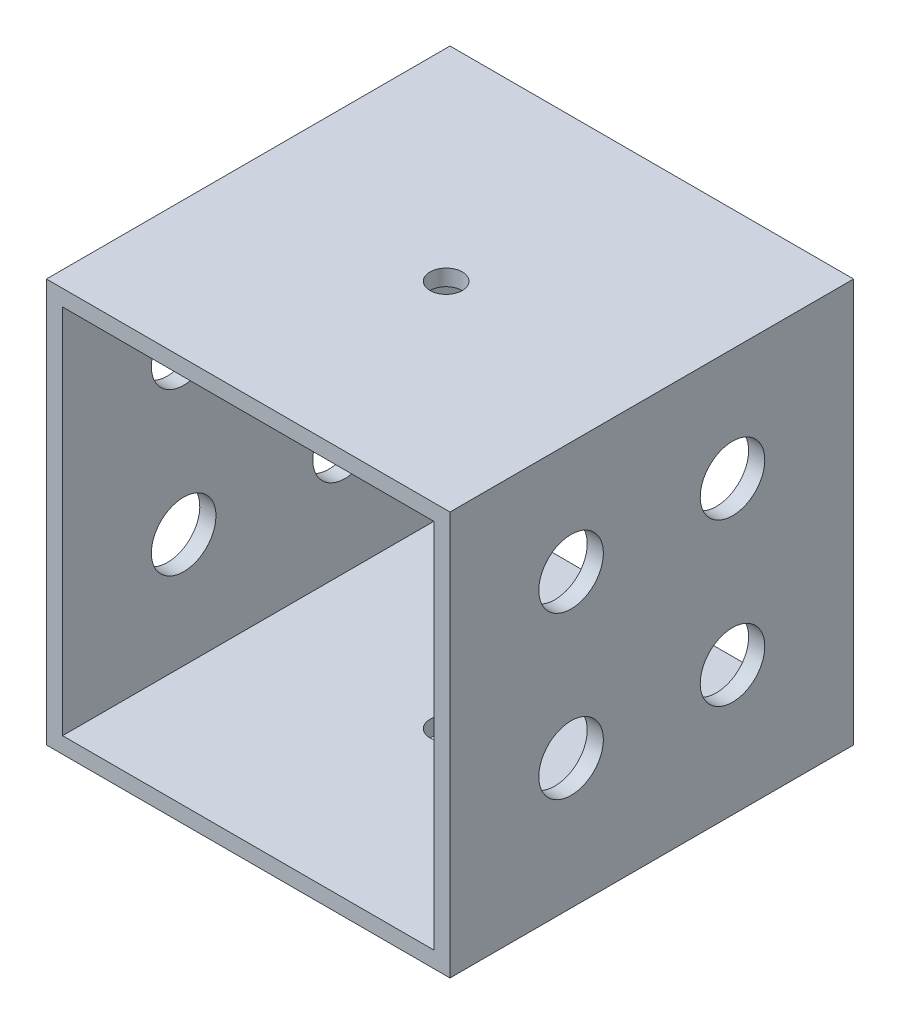
ISO-10303-21;
HEADER;
FILE_DESCRIPTION(('STEP AP214'),'2;1');
FILE_NAME('part.step','',(''),(''),'','','');
FILE_SCHEMA(('AUTOMOTIVE_DESIGN { 1 0 10303 214 1 1 1 1 }'));
ENDSEC;
DATA;
#1=APPLICATION_CONTEXT('core data for automotive mechanical design processes');
#2=APPLICATION_PROTOCOL_DEFINITION('international standard','automotive_design',2000,#1);
#3=PRODUCT_CONTEXT('',#1,'mechanical');
#4=PRODUCT('Part','Part','',(#3));
#5=PRODUCT_RELATED_PRODUCT_CATEGORY('part','',(#4));
#6=PRODUCT_DEFINITION_FORMATION('','',#4);
#7=PRODUCT_DEFINITION_CONTEXT('part definition',#1,'design');
#8=PRODUCT_DEFINITION('design','',#6,#7);
#9=PRODUCT_DEFINITION_SHAPE('','',#8);
#10=(LENGTH_UNIT() NAMED_UNIT(*) SI_UNIT(.MILLI.,.METRE.));
#11=(NAMED_UNIT(*) PLANE_ANGLE_UNIT() SI_UNIT($,.RADIAN.));
#12=(NAMED_UNIT(*) SI_UNIT($,.STERADIAN.) SOLID_ANGLE_UNIT());
#13=UNCERTAINTY_MEASURE_WITH_UNIT(LENGTH_MEASURE(1.E-05),#10,'distance_accuracy_value','');
#14=(GEOMETRIC_REPRESENTATION_CONTEXT(3) GLOBAL_UNCERTAINTY_ASSIGNED_CONTEXT((#13)) GLOBAL_UNIT_ASSIGNED_CONTEXT((#10,
#11,#12)) REPRESENTATION_CONTEXT('',''));
#15=CARTESIAN_POINT('',(0.,0.,0.));
#16=DIRECTION('',(0.,0.,1.));
#17=DIRECTION('',(1.,0.,0.));
#18=AXIS2_PLACEMENT_3D('',#15,#16,#17);
#19=CARTESIAN_POINT('',(0.,0.,25.));
#20=DIRECTION('',(0.,0.,1.));
#21=DIRECTION('',(1.,0.,0.));
#22=AXIS2_PLACEMENT_3D('',#19,#20,#21);
#23=PLANE('',#22);
#24=DIRECTION('',(0.,1.,0.));
#25=VECTOR('',#24,1.);
#26=CARTESIAN_POINT('',(12.5,12.5,25.));
#27=LINE('',#26,#25);
#28=CARTESIAN_POINT('',(12.5,-12.5,25.));
#29=VERTEX_POINT('',#28);
#30=CARTESIAN_POINT('',(12.5,12.5,25.));
#31=VERTEX_POINT('',#30);
#32=EDGE_CURVE('E138',#29,#31,#27,.T.);
#33=ORIENTED_EDGE('',*,*,#32,.T.);
#34=DIRECTION('',(-1.,0.,0.));
#35=VECTOR('',#34,1.);
#36=CARTESIAN_POINT('',(-12.5,12.5,25.));
#37=LINE('',#36,#35);
#38=CARTESIAN_POINT('',(-12.5,12.5,25.));
#39=VERTEX_POINT('',#38);
#40=EDGE_CURVE('E141',#31,#39,#37,.T.);
#41=ORIENTED_EDGE('',*,*,#40,.T.);
#42=DIRECTION('',(0.,-1.,0.));
#43=VECTOR('',#42,1.);
#44=CARTESIAN_POINT('',(-12.5,12.5,25.));
#45=LINE('',#44,#43);
#46=CARTESIAN_POINT('',(-12.5,-12.5,25.));
#47=VERTEX_POINT('',#46);
#48=EDGE_CURVE('E144',#39,#47,#45,.T.);
#49=ORIENTED_EDGE('',*,*,#48,.T.);
#50=DIRECTION('',(1.,0.,0.));
#51=VECTOR('',#50,1.);
#52=CARTESIAN_POINT('',(-12.5,-12.5,25.));
#53=LINE('',#52,#51);
#54=EDGE_CURVE('E146',#47,#29,#53,.T.);
#55=ORIENTED_EDGE('',*,*,#54,.T.);
#56=EDGE_LOOP('',(#33,#41,#49,#55));
#57=FACE_BOUND('',#56,.T.);
#58=DIRECTION('',(0.,-1.,0.));
#59=VECTOR('',#58,1.);
#60=CARTESIAN_POINT('',(-11.5,11.5,25.));
#61=LINE('',#60,#59);
#62=CARTESIAN_POINT('',(-11.5,11.5,25.));
#63=VERTEX_POINT('',#62);
#64=CARTESIAN_POINT('',(-11.5,-11.5,25.));
#65=VERTEX_POINT('',#64);
#66=EDGE_CURVE('E108',#63,#65,#61,.T.);
#67=ORIENTED_EDGE('',*,*,#66,.F.);
#68=DIRECTION('',(-1.,0.,0.));
#69=VECTOR('',#68,1.);
#70=CARTESIAN_POINT('',(-11.5,11.5,25.));
#71=LINE('',#70,#69);
#72=CARTESIAN_POINT('',(11.5,11.5,25.));
#73=VERTEX_POINT('',#72);
#74=EDGE_CURVE('E100',#73,#63,#71,.T.);
#75=ORIENTED_EDGE('',*,*,#74,.F.);
#76=DIRECTION('',(0.,1.,0.));
#77=VECTOR('',#76,1.);
#78=CARTESIAN_POINT('',(11.5,11.5,25.));
#79=LINE('',#78,#77);
#80=CARTESIAN_POINT('',(11.5,-11.5,25.));
#81=VERTEX_POINT('',#80);
#82=EDGE_CURVE('E122',#81,#73,#79,.T.);
#83=ORIENTED_EDGE('',*,*,#82,.F.);
#84=DIRECTION('',(1.,0.,0.));
#85=VECTOR('',#84,1.);
#86=CARTESIAN_POINT('',(-11.5,-11.5,25.));
#87=LINE('',#86,#85);
#88=EDGE_CURVE('E120',#65,#81,#87,.T.);
#89=ORIENTED_EDGE('',*,*,#88,.F.);
#90=EDGE_LOOP('',(#67,#75,#83,#89));
#91=FACE_BOUND('',#90,.T.);
#92=ADVANCED_FACE('F33',(#57,#91),#23,.T.);
#93=CARTESIAN_POINT('',(0.,0.,0.));
#94=DIRECTION('',(0.,0.,1.));
#95=DIRECTION('',(1.,0.,0.));
#96=AXIS2_PLACEMENT_3D('',#93,#94,#95);
#97=PLANE('',#96);
#98=DIRECTION('',(0.,1.,0.));
#99=VECTOR('',#98,1.);
#100=CARTESIAN_POINT('',(12.5,12.5,0.));
#101=LINE('',#100,#99);
#102=CARTESIAN_POINT('',(12.5,-12.5,0.));
#103=VERTEX_POINT('',#102);
#104=CARTESIAN_POINT('',(12.5,12.5,0.));
#105=VERTEX_POINT('',#104);
#106=EDGE_CURVE('E116',#103,#105,#101,.T.);
#107=ORIENTED_EDGE('',*,*,#106,.F.);
#108=DIRECTION('',(1.,0.,0.));
#109=VECTOR('',#108,1.);
#110=CARTESIAN_POINT('',(-12.5,-12.5,0.));
#111=LINE('',#110,#109);
#112=CARTESIAN_POINT('',(-12.5,-12.5,0.));
#113=VERTEX_POINT('',#112);
#114=EDGE_CURVE('E142',#113,#103,#111,.T.);
#115=ORIENTED_EDGE('',*,*,#114,.F.);
#116=DIRECTION('',(0.,-1.,0.));
#117=VECTOR('',#116,1.);
#118=CARTESIAN_POINT('',(-12.5,12.5,0.));
#119=LINE('',#118,#117);
#120=CARTESIAN_POINT('',(-12.5,12.5,0.));
#121=VERTEX_POINT('',#120);
#122=EDGE_CURVE('E153',#121,#113,#119,.T.);
#123=ORIENTED_EDGE('',*,*,#122,.F.);
#124=DIRECTION('',(-1.,0.,0.));
#125=VECTOR('',#124,1.);
#126=CARTESIAN_POINT('',(-12.5,12.5,0.));
#127=LINE('',#126,#125);
#128=EDGE_CURVE('E151',#105,#121,#127,.T.);
#129=ORIENTED_EDGE('',*,*,#128,.F.);
#130=EDGE_LOOP('',(#107,#115,#123,#129));
#131=FACE_BOUND('',#130,.T.);
#132=DIRECTION('',(-1.,0.,0.));
#133=VECTOR('',#132,1.);
#134=CARTESIAN_POINT('',(-11.5,11.5,0.));
#135=LINE('',#134,#133);
#136=CARTESIAN_POINT('',(11.5,11.5,0.));
#137=VERTEX_POINT('',#136);
#138=CARTESIAN_POINT('',(-11.5,11.5,0.));
#139=VERTEX_POINT('',#138);
#140=EDGE_CURVE('E58',#137,#139,#135,.T.);
#141=ORIENTED_EDGE('',*,*,#140,.T.);
#142=DIRECTION('',(0.,-1.,0.));
#143=VECTOR('',#142,1.);
#144=CARTESIAN_POINT('',(-11.5,11.5,0.));
#145=LINE('',#144,#143);
#146=CARTESIAN_POINT('',(-11.5,-11.5,0.));
#147=VERTEX_POINT('',#146);
#148=EDGE_CURVE('E115',#139,#147,#145,.T.);
#149=ORIENTED_EDGE('',*,*,#148,.T.);
#150=DIRECTION('',(1.,0.,0.));
#151=VECTOR('',#150,1.);
#152=CARTESIAN_POINT('',(-11.5,-11.5,0.));
#153=LINE('',#152,#151);
#154=CARTESIAN_POINT('',(11.5,-11.5,0.));
#155=VERTEX_POINT('',#154);
#156=EDGE_CURVE('E130',#147,#155,#153,.T.);
#157=ORIENTED_EDGE('',*,*,#156,.T.);
#158=DIRECTION('',(0.,1.,0.));
#159=VECTOR('',#158,1.);
#160=CARTESIAN_POINT('',(11.5,11.5,0.));
#161=LINE('',#160,#159);
#162=EDGE_CURVE('E109',#155,#137,#161,.T.);
#163=ORIENTED_EDGE('',*,*,#162,.T.);
#164=EDGE_LOOP('',(#141,#149,#157,#163));
#165=FACE_BOUND('',#164,.T.);
#166=ADVANCED_FACE('F217',(#131,#165),#97,.F.);
#167=CARTESIAN_POINT('',(12.5,12.5,25.));
#168=DIRECTION('',(-1.,0.,0.));
#169=DIRECTION('',(0.,-1.,0.));
#170=AXIS2_PLACEMENT_3D('',#167,#168,#169);
#171=PLANE('',#170);
#172=CARTESIAN_POINT('',(12.5,5.54647895510931,7.5));
#173=DIRECTION('',(1.,0.,0.));
#174=DIRECTION('',(0.,1.,0.));
#175=AXIS2_PLACEMENT_3D('',#172,#173,#174);
#176=CIRCLE('',#175,2.);
#177=CARTESIAN_POINT('',(12.5,7.54647895510931,7.5));
#178=VERTEX_POINT('',#177);
#179=EDGE_CURVE('E313',#178,#178,#176,.T.);
#180=ORIENTED_EDGE('',*,*,#179,.F.);
#181=EDGE_LOOP('',(#180));
#182=FACE_BOUND('',#181,.T.);
#183=CARTESIAN_POINT('',(12.5,-4.4535210448907,17.5));
#184=DIRECTION('',(1.,0.,0.));
#185=DIRECTION('',(0.,1.,0.));
#186=AXIS2_PLACEMENT_3D('',#183,#184,#185);
#187=CIRCLE('',#186,2.);
#188=CARTESIAN_POINT('',(12.5,-2.45352104489069,17.5));
#189=VERTEX_POINT('',#188);
#190=EDGE_CURVE('E300',#189,#189,#187,.T.);
#191=ORIENTED_EDGE('',*,*,#190,.F.);
#192=EDGE_LOOP('',(#191));
#193=FACE_BOUND('',#192,.T.);
#194=CARTESIAN_POINT('',(12.5,-4.4535210448907,7.5));
#195=DIRECTION('',(1.,0.,0.));
#196=DIRECTION('',(0.,1.,0.));
#197=AXIS2_PLACEMENT_3D('',#194,#195,#196);
#198=CIRCLE('',#197,2.);
#199=CARTESIAN_POINT('',(12.5,-2.45352104489069,7.5));
#200=VERTEX_POINT('',#199);
#201=EDGE_CURVE('E301',#200,#200,#198,.T.);
#202=ORIENTED_EDGE('',*,*,#201,.F.);
#203=EDGE_LOOP('',(#202));
#204=FACE_BOUND('',#203,.T.);
#205=CARTESIAN_POINT('',(12.5,5.54647895510931,17.5));
#206=DIRECTION('',(1.,0.,0.));
#207=DIRECTION('',(0.,1.,0.));
#208=AXIS2_PLACEMENT_3D('',#205,#206,#207);
#209=CIRCLE('',#208,2.);
#210=CARTESIAN_POINT('',(12.5,7.54647895510931,17.5));
#211=VERTEX_POINT('',#210);
#212=EDGE_CURVE('E312',#211,#211,#209,.T.);
#213=ORIENTED_EDGE('',*,*,#212,.F.);
#214=EDGE_LOOP('',(#213));
#215=FACE_BOUND('',#214,.T.);
#216=ORIENTED_EDGE('',*,*,#106,.T.);
#217=DIRECTION('',(0.,0.,-1.));
#218=VECTOR('',#217,1.);
#219=CARTESIAN_POINT('',(12.5,12.5,25.));
#220=LINE('',#219,#218);
#221=EDGE_CURVE('E11',#31,#105,#220,.T.);
#222=ORIENTED_EDGE('',*,*,#221,.F.);
#223=ORIENTED_EDGE('',*,*,#32,.F.);
#224=DIRECTION('',(0.,0.,-1.));
#225=VECTOR('',#224,1.);
#226=CARTESIAN_POINT('',(12.5,-12.5,25.));
#227=LINE('',#226,#225);
#228=EDGE_CURVE('E148',#29,#103,#227,.T.);
#229=ORIENTED_EDGE('',*,*,#228,.T.);
#230=EDGE_LOOP('',(#216,#222,#223,#229));
#231=FACE_BOUND('',#230,.T.);
#232=ADVANCED_FACE('F35',(#182,#193,#204,#215,#231),#171,.F.);
#233=CARTESIAN_POINT('',(-12.5,12.5,25.));
#234=DIRECTION('',(0.,-1.,0.));
#235=DIRECTION('',(0.,0.,-1.));
#236=AXIS2_PLACEMENT_3D('',#233,#234,#235);
#237=PLANE('',#236);
#238=CARTESIAN_POINT('',(0.,12.5,12.7388435913683));
#239=DIRECTION('',(0.,1.,0.));
#240=DIRECTION('',(0.,0.,1.));
#241=AXIS2_PLACEMENT_3D('',#238,#239,#240);
#242=CIRCLE('',#241,1.);
#243=CARTESIAN_POINT('',(0.,12.5,13.7388435913683));
#244=VERTEX_POINT('',#243);
#245=EDGE_CURVE('E192',#244,#244,#242,.T.);
#246=ORIENTED_EDGE('',*,*,#245,.F.);
#247=EDGE_LOOP('',(#246));
#248=FACE_BOUND('',#247,.T.);
#249=ORIENTED_EDGE('',*,*,#128,.T.);
#250=DIRECTION('',(0.,0.,-1.));
#251=VECTOR('',#250,1.);
#252=CARTESIAN_POINT('',(-12.5,12.5,25.));
#253=LINE('',#252,#251);
#254=EDGE_CURVE('E42',#39,#121,#253,.T.);
#255=ORIENTED_EDGE('',*,*,#254,.F.);
#256=ORIENTED_EDGE('',*,*,#40,.F.);
#257=ORIENTED_EDGE('',*,*,#221,.T.);
#258=EDGE_LOOP('',(#249,#255,#256,#257));
#259=FACE_BOUND('',#258,.T.);
#260=ADVANCED_FACE('F226',(#248,#259),#237,.F.);
#261=CARTESIAN_POINT('',(-12.5,12.5,25.));
#262=DIRECTION('',(1.,0.,0.));
#263=DIRECTION('',(0.,1.,0.));
#264=AXIS2_PLACEMENT_3D('',#261,#262,#263);
#265=PLANE('',#264);
#266=CARTESIAN_POINT('',(-12.5,5.5464789551093,7.5));
#267=DIRECTION('',(1.,0.,0.));
#268=DIRECTION('',(0.,1.,0.));
#269=AXIS2_PLACEMENT_3D('',#266,#267,#268);
#270=CIRCLE('',#269,2.);
#271=CARTESIAN_POINT('',(-12.5,7.5464789551093,7.5));
#272=VERTEX_POINT('',#271);
#273=EDGE_CURVE('E309',#272,#272,#270,.T.);
#274=ORIENTED_EDGE('',*,*,#273,.T.);
#275=EDGE_LOOP('',(#274));
#276=FACE_BOUND('',#275,.T.);
#277=CARTESIAN_POINT('',(-12.5,-4.4535210448907,17.5));
#278=DIRECTION('',(1.,0.,0.));
#279=DIRECTION('',(0.,1.,0.));
#280=AXIS2_PLACEMENT_3D('',#277,#278,#279);
#281=CIRCLE('',#280,2.);
#282=CARTESIAN_POINT('',(-12.5,-2.4535210448907,17.5));
#283=VERTEX_POINT('',#282);
#284=EDGE_CURVE('E304',#283,#283,#281,.T.);
#285=ORIENTED_EDGE('',*,*,#284,.T.);
#286=EDGE_LOOP('',(#285));
#287=FACE_BOUND('',#286,.T.);
#288=CARTESIAN_POINT('',(-12.5,-4.4535210448907,7.5));
#289=DIRECTION('',(1.,0.,0.));
#290=DIRECTION('',(0.,1.,0.));
#291=AXIS2_PLACEMENT_3D('',#288,#289,#290);
#292=CIRCLE('',#291,2.);
#293=CARTESIAN_POINT('',(-12.5,-2.4535210448907,7.5));
#294=VERTEX_POINT('',#293);
#295=EDGE_CURVE('E298',#294,#294,#292,.T.);
#296=ORIENTED_EDGE('',*,*,#295,.T.);
#297=EDGE_LOOP('',(#296));
#298=FACE_BOUND('',#297,.T.);
#299=CARTESIAN_POINT('',(-12.5,5.5464789551093,17.5));
#300=DIRECTION('',(1.,0.,0.));
#301=DIRECTION('',(0.,1.,0.));
#302=AXIS2_PLACEMENT_3D('',#299,#300,#301);
#303=CIRCLE('',#302,2.);
#304=CARTESIAN_POINT('',(-12.5,7.5464789551093,17.5));
#305=VERTEX_POINT('',#304);
#306=EDGE_CURVE('E171',#305,#305,#303,.T.);
#307=ORIENTED_EDGE('',*,*,#306,.T.);
#308=EDGE_LOOP('',(#307));
#309=FACE_BOUND('',#308,.T.);
#310=ORIENTED_EDGE('',*,*,#122,.T.);
#311=DIRECTION('',(0.,0.,-1.));
#312=VECTOR('',#311,1.);
#313=CARTESIAN_POINT('',(-12.5,-12.5,25.));
#314=LINE('',#313,#312);
#315=EDGE_CURVE('E158',#47,#113,#314,.T.);
#316=ORIENTED_EDGE('',*,*,#315,.F.);
#317=ORIENTED_EDGE('',*,*,#48,.F.);
#318=ORIENTED_EDGE('',*,*,#254,.T.);
#319=EDGE_LOOP('',(#310,#316,#317,#318));
#320=FACE_BOUND('',#319,.T.);
#321=ADVANCED_FACE('F212',(#276,#287,#298,#309,#320),#265,.F.);
#322=CARTESIAN_POINT('',(-12.5,-12.5,25.));
#323=DIRECTION('',(0.,1.,0.));
#324=DIRECTION('',(0.,0.,1.));
#325=AXIS2_PLACEMENT_3D('',#322,#323,#324);
#326=PLANE('',#325);
#327=CARTESIAN_POINT('',(0.,-12.5,12.7388435913683));
#328=DIRECTION('',(0.,1.,0.));
#329=DIRECTION('',(0.,0.,1.));
#330=AXIS2_PLACEMENT_3D('',#327,#328,#329);
#331=CIRCLE('',#330,1.);
#332=CARTESIAN_POINT('',(0.,-12.5,13.7388435913683));
#333=VERTEX_POINT('',#332);
#334=EDGE_CURVE('E166',#333,#333,#331,.T.);
#335=ORIENTED_EDGE('',*,*,#334,.T.);
#336=EDGE_LOOP('',(#335));
#337=FACE_BOUND('',#336,.T.);
#338=ORIENTED_EDGE('',*,*,#114,.T.);
#339=ORIENTED_EDGE('',*,*,#228,.F.);
#340=ORIENTED_EDGE('',*,*,#54,.F.);
#341=ORIENTED_EDGE('',*,*,#315,.T.);
#342=EDGE_LOOP('',(#338,#339,#340,#341));
#343=FACE_BOUND('',#342,.T.);
#344=ADVANCED_FACE('F203',(#337,#343),#326,.F.);
#345=CARTESIAN_POINT('',(-11.5,11.5,25.));
#346=DIRECTION('',(0.,-1.,0.));
#347=DIRECTION('',(0.,0.,-1.));
#348=AXIS2_PLACEMENT_3D('',#345,#346,#347);
#349=PLANE('',#348);
#350=CARTESIAN_POINT('',(0.,11.5,12.7388435913683));
#351=DIRECTION('',(0.,-1.,0.));
#352=DIRECTION('',(0.,0.,-1.));
#353=AXIS2_PLACEMENT_3D('',#350,#351,#352);
#354=CIRCLE('',#353,1.);
#355=CARTESIAN_POINT('',(0.,11.5,11.7388435913683));
#356=VERTEX_POINT('',#355);
#357=EDGE_CURVE('E128',#356,#356,#354,.T.);
#358=ORIENTED_EDGE('',*,*,#357,.F.);
#359=EDGE_LOOP('',(#358));
#360=FACE_BOUND('',#359,.T.);
#361=ORIENTED_EDGE('',*,*,#140,.F.);
#362=DIRECTION('',(0.,0.,-1.));
#363=VECTOR('',#362,1.);
#364=CARTESIAN_POINT('',(11.5,11.5,25.));
#365=LINE('',#364,#363);
#366=EDGE_CURVE('E104',#73,#137,#365,.T.);
#367=ORIENTED_EDGE('',*,*,#366,.F.);
#368=ORIENTED_EDGE('',*,*,#74,.T.);
#369=DIRECTION('',(0.,0.,-1.));
#370=VECTOR('',#369,1.);
#371=CARTESIAN_POINT('',(-11.5,11.5,25.));
#372=LINE('',#371,#370);
#373=EDGE_CURVE('E103',#63,#139,#372,.T.);
#374=ORIENTED_EDGE('',*,*,#373,.T.);
#375=EDGE_LOOP('',(#361,#367,#368,#374));
#376=FACE_BOUND('',#375,.T.);
#377=ADVANCED_FACE('F102',(#360,#376),#349,.T.);
#378=CARTESIAN_POINT('',(-11.5,11.5,25.));
#379=DIRECTION('',(1.,0.,0.));
#380=DIRECTION('',(0.,1.,0.));
#381=AXIS2_PLACEMENT_3D('',#378,#379,#380);
#382=PLANE('',#381);
#383=CARTESIAN_POINT('',(-11.5,5.5464789551093,7.5));
#384=DIRECTION('',(1.,0.,0.));
#385=DIRECTION('',(0.,1.,0.));
#386=AXIS2_PLACEMENT_3D('',#383,#384,#385);
#387=CIRCLE('',#386,2.);
#388=CARTESIAN_POINT('',(-11.5,7.5464789551093,7.5));
#389=VERTEX_POINT('',#388);
#390=EDGE_CURVE('E189',#389,#389,#387,.T.);
#391=ORIENTED_EDGE('',*,*,#390,.F.);
#392=EDGE_LOOP('',(#391));
#393=FACE_BOUND('',#392,.T.);
#394=CARTESIAN_POINT('',(-11.5,-4.4535210448907,17.5));
#395=DIRECTION('',(1.,0.,0.));
#396=DIRECTION('',(0.,1.,0.));
#397=AXIS2_PLACEMENT_3D('',#394,#395,#396);
#398=CIRCLE('',#397,2.);
#399=CARTESIAN_POINT('',(-11.5,-2.4535210448907,17.5));
#400=VERTEX_POINT('',#399);
#401=EDGE_CURVE('E177',#400,#400,#398,.T.);
#402=ORIENTED_EDGE('',*,*,#401,.F.);
#403=EDGE_LOOP('',(#402));
#404=FACE_BOUND('',#403,.T.);
#405=CARTESIAN_POINT('',(-11.5,-4.4535210448907,7.5));
#406=DIRECTION('',(1.,0.,0.));
#407=DIRECTION('',(0.,1.,0.));
#408=AXIS2_PLACEMENT_3D('',#405,#406,#407);
#409=CIRCLE('',#408,2.);
#410=CARTESIAN_POINT('',(-11.5,-2.4535210448907,7.5));
#411=VERTEX_POINT('',#410);
#412=EDGE_CURVE('E174',#411,#411,#409,.T.);
#413=ORIENTED_EDGE('',*,*,#412,.F.);
#414=EDGE_LOOP('',(#413));
#415=FACE_BOUND('',#414,.T.);
#416=CARTESIAN_POINT('',(-11.5,5.5464789551093,17.5));
#417=DIRECTION('',(1.,0.,0.));
#418=DIRECTION('',(0.,1.,0.));
#419=AXIS2_PLACEMENT_3D('',#416,#417,#418);
#420=CIRCLE('',#419,2.);
#421=CARTESIAN_POINT('',(-11.5,7.5464789551093,17.5));
#422=VERTEX_POINT('',#421);
#423=EDGE_CURVE('E170',#422,#422,#420,.T.);
#424=ORIENTED_EDGE('',*,*,#423,.F.);
#425=EDGE_LOOP('',(#424));
#426=FACE_BOUND('',#425,.T.);
#427=ORIENTED_EDGE('',*,*,#148,.F.);
#428=ORIENTED_EDGE('',*,*,#373,.F.);
#429=ORIENTED_EDGE('',*,*,#66,.T.);
#430=DIRECTION('',(0.,0.,-1.));
#431=VECTOR('',#430,1.);
#432=CARTESIAN_POINT('',(-11.5,-11.5,25.));
#433=LINE('',#432,#431);
#434=EDGE_CURVE('E117',#65,#147,#433,.T.);
#435=ORIENTED_EDGE('',*,*,#434,.T.);
#436=EDGE_LOOP('',(#427,#428,#429,#435));
#437=FACE_BOUND('',#436,.T.);
#438=ADVANCED_FACE('F112',(#393,#404,#415,#426,#437),#382,.T.);
#439=CARTESIAN_POINT('',(-11.5,-11.5,25.));
#440=DIRECTION('',(0.,1.,0.));
#441=DIRECTION('',(0.,0.,1.));
#442=AXIS2_PLACEMENT_3D('',#439,#440,#441);
#443=PLANE('',#442);
#444=CARTESIAN_POINT('',(0.,-11.5,12.7388435913683));
#445=DIRECTION('',(0.,1.,0.));
#446=DIRECTION('',(0.,0.,1.));
#447=AXIS2_PLACEMENT_3D('',#444,#445,#446);
#448=CIRCLE('',#447,1.);
#449=CARTESIAN_POINT('',(0.,-11.5,13.7388435913683));
#450=VERTEX_POINT('',#449);
#451=EDGE_CURVE('E163',#450,#450,#448,.T.);
#452=ORIENTED_EDGE('',*,*,#451,.F.);
#453=EDGE_LOOP('',(#452));
#454=FACE_BOUND('',#453,.T.);
#455=ORIENTED_EDGE('',*,*,#156,.F.);
#456=ORIENTED_EDGE('',*,*,#434,.F.);
#457=ORIENTED_EDGE('',*,*,#88,.T.);
#458=DIRECTION('',(0.,0.,-1.));
#459=VECTOR('',#458,1.);
#460=CARTESIAN_POINT('',(11.5,-11.5,25.));
#461=LINE('',#460,#459);
#462=EDGE_CURVE('E50',#81,#155,#461,.T.);
#463=ORIENTED_EDGE('',*,*,#462,.T.);
#464=EDGE_LOOP('',(#455,#456,#457,#463));
#465=FACE_BOUND('',#464,.T.);
#466=ADVANCED_FACE('F209',(#454,#465),#443,.T.);
#467=CARTESIAN_POINT('',(11.5,11.5,25.));
#468=DIRECTION('',(-1.,0.,0.));
#469=DIRECTION('',(0.,-1.,0.));
#470=AXIS2_PLACEMENT_3D('',#467,#468,#469);
#471=PLANE('',#470);
#472=CARTESIAN_POINT('',(11.5,5.54647895510931,7.5));
#473=DIRECTION('',(-1.,0.,0.));
#474=DIRECTION('',(0.,-1.,0.));
#475=AXIS2_PLACEMENT_3D('',#472,#473,#474);
#476=CIRCLE('',#475,2.);
#477=CARTESIAN_POINT('',(11.5,3.5464789551093,7.5));
#478=VERTEX_POINT('',#477);
#479=EDGE_CURVE('E37',#478,#478,#476,.T.);
#480=ORIENTED_EDGE('',*,*,#479,.F.);
#481=EDGE_LOOP('',(#480));
#482=FACE_BOUND('',#481,.T.);
#483=CARTESIAN_POINT('',(11.5,-4.4535210448907,17.5));
#484=DIRECTION('',(-1.,0.,0.));
#485=DIRECTION('',(0.,-1.,0.));
#486=AXIS2_PLACEMENT_3D('',#483,#484,#485);
#487=CIRCLE('',#486,2.);
#488=CARTESIAN_POINT('',(11.5,-6.4535210448907,17.5));
#489=VERTEX_POINT('',#488);
#490=EDGE_CURVE('E175',#489,#489,#487,.T.);
#491=ORIENTED_EDGE('',*,*,#490,.F.);
#492=EDGE_LOOP('',(#491));
#493=FACE_BOUND('',#492,.T.);
#494=CARTESIAN_POINT('',(11.5,-4.4535210448907,7.5));
#495=DIRECTION('',(-1.,0.,0.));
#496=DIRECTION('',(0.,-1.,0.));
#497=AXIS2_PLACEMENT_3D('',#494,#495,#496);
#498=CIRCLE('',#497,2.);
#499=CARTESIAN_POINT('',(11.5,-6.4535210448907,7.5));
#500=VERTEX_POINT('',#499);
#501=EDGE_CURVE('E172',#500,#500,#498,.T.);
#502=ORIENTED_EDGE('',*,*,#501,.F.);
#503=EDGE_LOOP('',(#502));
#504=FACE_BOUND('',#503,.T.);
#505=CARTESIAN_POINT('',(11.5,5.54647895510931,17.5));
#506=DIRECTION('',(-1.,0.,0.));
#507=DIRECTION('',(0.,-1.,0.));
#508=AXIS2_PLACEMENT_3D('',#505,#506,#507);
#509=CIRCLE('',#508,2.);
#510=CARTESIAN_POINT('',(11.5,3.5464789551093,17.5));
#511=VERTEX_POINT('',#510);
#512=EDGE_CURVE('E167',#511,#511,#509,.T.);
#513=ORIENTED_EDGE('',*,*,#512,.F.);
#514=EDGE_LOOP('',(#513));
#515=FACE_BOUND('',#514,.T.);
#516=ORIENTED_EDGE('',*,*,#162,.F.);
#517=ORIENTED_EDGE('',*,*,#462,.F.);
#518=ORIENTED_EDGE('',*,*,#82,.T.);
#519=ORIENTED_EDGE('',*,*,#366,.T.);
#520=EDGE_LOOP('',(#516,#517,#518,#519));
#521=FACE_BOUND('',#520,.T.);
#522=ADVANCED_FACE('F251',(#482,#493,#504,#515,#521),#471,.T.);
#523=CARTESIAN_POINT('',(0.,-12.5,12.7388435913683));
#524=DIRECTION('',(0.,1.,0.));
#525=DIRECTION('',(0.,0.,1.));
#526=AXIS2_PLACEMENT_3D('',#523,#524,#525);
#527=CYLINDRICAL_SURFACE('',#526,1.);
#528=ORIENTED_EDGE('',*,*,#451,.T.);
#529=EDGE_LOOP('',(#528));
#530=FACE_BOUND('',#529,.T.);
#531=ORIENTED_EDGE('',*,*,#334,.F.);
#532=EDGE_LOOP('',(#531));
#533=FACE_BOUND('',#532,.T.);
#534=ADVANCED_FACE('F253',(#530,#533),#527,.F.);
#535=ORIENTED_EDGE('',*,*,#357,.T.);
#536=EDGE_LOOP('',(#535));
#537=FACE_BOUND('',#536,.T.);
#538=ORIENTED_EDGE('',*,*,#245,.T.);
#539=EDGE_LOOP('',(#538));
#540=FACE_BOUND('',#539,.T.);
#541=ADVANCED_FACE('F199',(#537,#540),#527,.F.);
#542=CARTESIAN_POINT('',(-12.5,5.5464789551093,17.5));
#543=DIRECTION('',(1.,0.,0.));
#544=DIRECTION('',(0.,1.,0.));
#545=AXIS2_PLACEMENT_3D('',#542,#543,#544);
#546=CYLINDRICAL_SURFACE('',#545,2.);
#547=ORIENTED_EDGE('',*,*,#512,.T.);
#548=EDGE_LOOP('',(#547));
#549=FACE_BOUND('',#548,.T.);
#550=ORIENTED_EDGE('',*,*,#212,.T.);
#551=EDGE_LOOP('',(#550));
#552=FACE_BOUND('',#551,.T.);
#553=ADVANCED_FACE('F267',(#549,#552),#546,.F.);
#554=CARTESIAN_POINT('',(-12.5,-4.4535210448907,7.5));
#555=DIRECTION('',(1.,0.,0.));
#556=DIRECTION('',(0.,1.,0.));
#557=AXIS2_PLACEMENT_3D('',#554,#555,#556);
#558=CYLINDRICAL_SURFACE('',#557,2.);
#559=ORIENTED_EDGE('',*,*,#501,.T.);
#560=EDGE_LOOP('',(#559));
#561=FACE_BOUND('',#560,.T.);
#562=ORIENTED_EDGE('',*,*,#201,.T.);
#563=EDGE_LOOP('',(#562));
#564=FACE_BOUND('',#563,.T.);
#565=ADVANCED_FACE('F270',(#561,#564),#558,.F.);
#566=CARTESIAN_POINT('',(-12.5,-4.4535210448907,17.5));
#567=DIRECTION('',(1.,0.,0.));
#568=DIRECTION('',(0.,1.,0.));
#569=AXIS2_PLACEMENT_3D('',#566,#567,#568);
#570=CYLINDRICAL_SURFACE('',#569,2.);
#571=ORIENTED_EDGE('',*,*,#490,.T.);
#572=EDGE_LOOP('',(#571));
#573=FACE_BOUND('',#572,.T.);
#574=ORIENTED_EDGE('',*,*,#190,.T.);
#575=EDGE_LOOP('',(#574));
#576=FACE_BOUND('',#575,.T.);
#577=ADVANCED_FACE('F273',(#573,#576),#570,.F.);
#578=CARTESIAN_POINT('',(-12.5,5.5464789551093,7.5));
#579=DIRECTION('',(1.,0.,0.));
#580=DIRECTION('',(0.,1.,0.));
#581=AXIS2_PLACEMENT_3D('',#578,#579,#580);
#582=CYLINDRICAL_SURFACE('',#581,2.);
#583=ORIENTED_EDGE('',*,*,#479,.T.);
#584=EDGE_LOOP('',(#583));
#585=FACE_BOUND('',#584,.T.);
#586=ORIENTED_EDGE('',*,*,#179,.T.);
#587=EDGE_LOOP('',(#586));
#588=FACE_BOUND('',#587,.T.);
#589=ADVANCED_FACE('F276',(#585,#588),#582,.F.);
#590=ORIENTED_EDGE('',*,*,#423,.T.);
#591=EDGE_LOOP('',(#590));
#592=FACE_BOUND('',#591,.T.);
#593=ORIENTED_EDGE('',*,*,#306,.F.);
#594=EDGE_LOOP('',(#593));
#595=FACE_BOUND('',#594,.T.);
#596=ADVANCED_FACE('F272',(#592,#595),#546,.F.);
#597=ORIENTED_EDGE('',*,*,#412,.T.);
#598=EDGE_LOOP('',(#597));
#599=FACE_BOUND('',#598,.T.);
#600=ORIENTED_EDGE('',*,*,#295,.F.);
#601=EDGE_LOOP('',(#600));
#602=FACE_BOUND('',#601,.T.);
#603=ADVANCED_FACE('F284',(#599,#602),#558,.F.);
#604=ORIENTED_EDGE('',*,*,#401,.T.);
#605=EDGE_LOOP('',(#604));
#606=FACE_BOUND('',#605,.T.);
#607=ORIENTED_EDGE('',*,*,#284,.F.);
#608=EDGE_LOOP('',(#607));
#609=FACE_BOUND('',#608,.T.);
#610=ADVANCED_FACE('F277',(#606,#609),#570,.F.);
#611=ORIENTED_EDGE('',*,*,#390,.T.);
#612=EDGE_LOOP('',(#611));
#613=FACE_BOUND('',#612,.T.);
#614=ORIENTED_EDGE('',*,*,#273,.F.);
#615=EDGE_LOOP('',(#614));
#616=FACE_BOUND('',#615,.T.);
#617=ADVANCED_FACE('F281',(#613,#616),#582,.F.);
#618=CLOSED_SHELL('',(#92,#166,#232,#260,#321,#344,#377,#438,#466,#522,#534,#541,#553,#565,#577,
#589,#596,#603,#610,#617));
#619=MANIFOLD_SOLID_BREP('B2',#618);
#620=ADVANCED_BREP_SHAPE_REPRESENTATION('',(#18,#619),#14);
#621=SHAPE_DEFINITION_REPRESENTATION(#9,#620);
ENDSEC;
END-ISO-10303-21;
